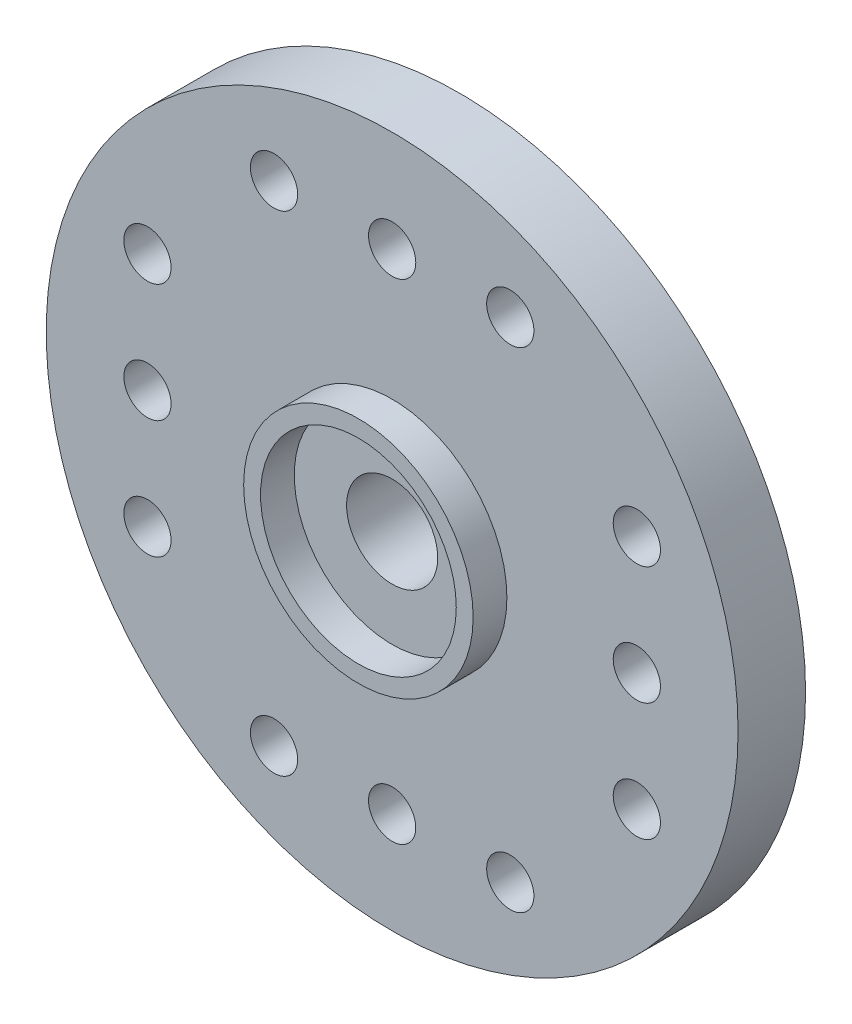
ISO-10303-21;
HEADER;
FILE_DESCRIPTION(('STEP AP214'),'2;1');
FILE_NAME('part.step','',(''),(''),'','','');
FILE_SCHEMA(('AUTOMOTIVE_DESIGN { 1 0 10303 214 1 1 1 1 }'));
ENDSEC;
DATA;
#1=APPLICATION_CONTEXT('core data for automotive mechanical design processes');
#2=APPLICATION_PROTOCOL_DEFINITION('international standard','automotive_design',2000,#1);
#3=PRODUCT_CONTEXT('',#1,'mechanical');
#4=PRODUCT('Part','Part','',(#3));
#5=PRODUCT_RELATED_PRODUCT_CATEGORY('part','',(#4));
#6=PRODUCT_DEFINITION_FORMATION('','',#4);
#7=PRODUCT_DEFINITION_CONTEXT('part definition',#1,'design');
#8=PRODUCT_DEFINITION('design','',#6,#7);
#9=PRODUCT_DEFINITION_SHAPE('','',#8);
#10=(LENGTH_UNIT() NAMED_UNIT(*) SI_UNIT(.MILLI.,.METRE.));
#11=(NAMED_UNIT(*) PLANE_ANGLE_UNIT() SI_UNIT($,.RADIAN.));
#12=(NAMED_UNIT(*) SI_UNIT($,.STERADIAN.) SOLID_ANGLE_UNIT());
#13=UNCERTAINTY_MEASURE_WITH_UNIT(LENGTH_MEASURE(1.E-05),#10,'distance_accuracy_value','');
#14=(GEOMETRIC_REPRESENTATION_CONTEXT(3) GLOBAL_UNCERTAINTY_ASSIGNED_CONTEXT((#13)) GLOBAL_UNIT_ASSIGNED_CONTEXT((#10,
#11,#12)) REPRESENTATION_CONTEXT('',''));
#15=CARTESIAN_POINT('',(0.,0.,0.));
#16=DIRECTION('',(0.,0.,1.));
#17=DIRECTION('',(1.,0.,0.));
#18=AXIS2_PLACEMENT_3D('',#15,#16,#17);
#19=CARTESIAN_POINT('',(0.,0.,0.));
#20=DIRECTION('',(0.,0.,1.));
#21=DIRECTION('',(1.,0.,0.));
#22=AXIS2_PLACEMENT_3D('',#19,#20,#21);
#23=PLANE('',#22);
#24=CARTESIAN_POINT('',(-7.25,0.,0.));
#25=DIRECTION('',(0.,0.,1.));
#26=DIRECTION('',(0.,1.,0.));
#27=AXIS2_PLACEMENT_3D('',#24,#25,#26);
#28=CIRCLE('',#27,0.7);
#29=CARTESIAN_POINT('',(-7.25,0.700000000000025,0.));
#30=VERTEX_POINT('',#29);
#31=EDGE_CURVE('E129',#30,#30,#28,.T.);
#32=ORIENTED_EDGE('',*,*,#31,.T.);
#33=EDGE_LOOP('',(#32));
#34=FACE_BOUND('',#33,.T.);
#35=CARTESIAN_POINT('',(-7.25000000000001,-3.49999999999998,0.));
#36=DIRECTION('',(0.,0.,1.));
#37=DIRECTION('',(0.,1.,0.));
#38=AXIS2_PLACEMENT_3D('',#35,#36,#37);
#39=CIRCLE('',#38,0.700000000000001);
#40=CARTESIAN_POINT('',(-7.25000000000001,-2.79999999999998,0.));
#41=VERTEX_POINT('',#40);
#42=EDGE_CURVE('E123',#41,#41,#39,.T.);
#43=ORIENTED_EDGE('',*,*,#42,.T.);
#44=EDGE_LOOP('',(#43));
#45=FACE_BOUND('',#44,.T.);
#46=CARTESIAN_POINT('',(-7.24999999999999,3.50000000000003,0.));
#47=DIRECTION('',(0.,0.,1.));
#48=DIRECTION('',(0.,-1.,0.));
#49=AXIS2_PLACEMENT_3D('',#46,#47,#48);
#50=CIRCLE('',#49,0.7);
#51=CARTESIAN_POINT('',(-7.24999999999999,2.80000000000003,0.));
#52=VERTEX_POINT('',#51);
#53=EDGE_CURVE('E117',#52,#52,#50,.T.);
#54=ORIENTED_EDGE('',*,*,#53,.T.);
#55=EDGE_LOOP('',(#54));
#56=FACE_BOUND('',#55,.T.);
#57=CARTESIAN_POINT('',(7.25000000000001,3.49999999999998,0.));
#58=DIRECTION('',(0.,0.,1.));
#59=DIRECTION('',(0.,1.,0.));
#60=AXIS2_PLACEMENT_3D('',#57,#58,#59);
#61=CIRCLE('',#60,0.7);
#62=CARTESIAN_POINT('',(7.25000000000001,4.19999999999997,0.));
#63=VERTEX_POINT('',#62);
#64=EDGE_CURVE('E111',#63,#63,#61,.T.);
#65=ORIENTED_EDGE('',*,*,#64,.T.);
#66=EDGE_LOOP('',(#65));
#67=FACE_BOUND('',#66,.T.);
#68=CARTESIAN_POINT('',(7.24999999999999,-3.50000000000003,0.));
#69=DIRECTION('',(0.,0.,1.));
#70=DIRECTION('',(0.,-1.,0.));
#71=AXIS2_PLACEMENT_3D('',#68,#69,#70);
#72=CIRCLE('',#71,0.700000000000001);
#73=CARTESIAN_POINT('',(7.24999999999999,-4.20000000000003,0.));
#74=VERTEX_POINT('',#73);
#75=EDGE_CURVE('E105',#74,#74,#72,.T.);
#76=ORIENTED_EDGE('',*,*,#75,.T.);
#77=EDGE_LOOP('',(#76));
#78=FACE_BOUND('',#77,.T.);
#79=CARTESIAN_POINT('',(7.25,0.,0.));
#80=DIRECTION('',(0.,0.,1.));
#81=DIRECTION('',(0.,-1.,0.));
#82=AXIS2_PLACEMENT_3D('',#79,#80,#81);
#83=CIRCLE('',#82,0.7);
#84=CARTESIAN_POINT('',(7.25,-0.700000000000025,0.));
#85=VERTEX_POINT('',#84);
#86=EDGE_CURVE('E99',#85,#85,#83,.T.);
#87=ORIENTED_EDGE('',*,*,#86,.T.);
#88=EDGE_LOOP('',(#87));
#89=FACE_BOUND('',#88,.T.);
#90=CARTESIAN_POINT('',(0.,-7.25,0.));
#91=DIRECTION('',(0.,0.,1.));
#92=DIRECTION('',(-1.,0.,0.));
#93=AXIS2_PLACEMENT_3D('',#90,#91,#92);
#94=CIRCLE('',#93,0.7);
#95=CARTESIAN_POINT('',(-0.7,-7.25,0.));
#96=VERTEX_POINT('',#95);
#97=EDGE_CURVE('E93',#96,#96,#94,.T.);
#98=ORIENTED_EDGE('',*,*,#97,.T.);
#99=EDGE_LOOP('',(#98));
#100=FACE_BOUND('',#99,.T.);
#101=CARTESIAN_POINT('',(3.5,-7.25,0.));
#102=DIRECTION('',(0.,0.,1.));
#103=DIRECTION('',(-1.,0.,0.));
#104=AXIS2_PLACEMENT_3D('',#101,#102,#103);
#105=CIRCLE('',#104,0.700000000000001);
#106=CARTESIAN_POINT('',(2.8,-7.25,0.));
#107=VERTEX_POINT('',#106);
#108=EDGE_CURVE('E87',#107,#107,#105,.T.);
#109=ORIENTED_EDGE('',*,*,#108,.T.);
#110=EDGE_LOOP('',(#109));
#111=FACE_BOUND('',#110,.T.);
#112=CARTESIAN_POINT('',(-3.5,-7.25,0.));
#113=DIRECTION('',(0.,0.,1.));
#114=DIRECTION('',(1.,0.,0.));
#115=AXIS2_PLACEMENT_3D('',#112,#113,#114);
#116=CIRCLE('',#115,0.7);
#117=CARTESIAN_POINT('',(-2.8,-7.25,0.));
#118=VERTEX_POINT('',#117);
#119=EDGE_CURVE('E81',#118,#118,#116,.T.);
#120=ORIENTED_EDGE('',*,*,#119,.T.);
#121=EDGE_LOOP('',(#120));
#122=FACE_BOUND('',#121,.T.);
#123=CARTESIAN_POINT('',(-3.5,7.25,0.));
#124=DIRECTION('',(0.,0.,1.));
#125=DIRECTION('',(-1.,0.,0.));
#126=AXIS2_PLACEMENT_3D('',#123,#124,#125);
#127=CIRCLE('',#126,0.7);
#128=CARTESIAN_POINT('',(-4.2,7.25,0.));
#129=VERTEX_POINT('',#128);
#130=EDGE_CURVE('E75',#129,#129,#127,.T.);
#131=ORIENTED_EDGE('',*,*,#130,.T.);
#132=EDGE_LOOP('',(#131));
#133=FACE_BOUND('',#132,.T.);
#134=CARTESIAN_POINT('',(3.5,7.25,0.));
#135=DIRECTION('',(0.,0.,1.));
#136=DIRECTION('',(1.,0.,0.));
#137=AXIS2_PLACEMENT_3D('',#134,#135,#136);
#138=CIRCLE('',#137,0.700000000000001);
#139=CARTESIAN_POINT('',(4.2,7.25,0.));
#140=VERTEX_POINT('',#139);
#141=EDGE_CURVE('E69',#140,#140,#138,.T.);
#142=ORIENTED_EDGE('',*,*,#141,.T.);
#143=EDGE_LOOP('',(#142));
#144=FACE_BOUND('',#143,.T.);
#145=CARTESIAN_POINT('',(0.,7.25,0.));
#146=DIRECTION('',(0.,0.,1.));
#147=DIRECTION('',(1.,0.,0.));
#148=AXIS2_PLACEMENT_3D('',#145,#146,#147);
#149=CIRCLE('',#148,0.7);
#150=CARTESIAN_POINT('',(0.7,7.25,0.));
#151=VERTEX_POINT('',#150);
#152=EDGE_CURVE('E63',#151,#151,#149,.T.);
#153=ORIENTED_EDGE('',*,*,#152,.T.);
#154=EDGE_LOOP('',(#153));
#155=FACE_BOUND('',#154,.T.);
#156=CARTESIAN_POINT('',(0.,0.,0.));
#157=DIRECTION('',(0.,0.,1.));
#158=DIRECTION('',(1.,0.,0.));
#159=AXIS2_PLACEMENT_3D('',#156,#157,#158);
#160=CIRCLE('',#159,10.25);
#161=CARTESIAN_POINT('',(10.25,0.,0.));
#162=VERTEX_POINT('',#161);
#163=EDGE_CURVE('E45',#162,#162,#160,.T.);
#164=ORIENTED_EDGE('',*,*,#163,.F.);
#165=EDGE_LOOP('',(#164));
#166=FACE_BOUND('',#165,.T.);
#167=CARTESIAN_POINT('',(0.,0.,0.));
#168=DIRECTION('',(0.,0.,1.));
#169=DIRECTION('',(1.,0.,0.));
#170=AXIS2_PLACEMENT_3D('',#167,#168,#169);
#171=CIRCLE('',#170,4.85);
#172=CARTESIAN_POINT('',(4.85,0.,0.));
#173=VERTEX_POINT('',#172);
#174=EDGE_CURVE('E10',#173,#173,#171,.F.);
#175=ORIENTED_EDGE('',*,*,#174,.F.);
#176=EDGE_LOOP('',(#175));
#177=FACE_BOUND('',#176,.T.);
#178=ADVANCED_FACE('F30',(#34,#45,#56,#67,#78,#89,#100,#111,#122,#133,#144,#155,#166,#177),#23,.F.);
#179=CARTESIAN_POINT('',(0.,0.,2.));
#180=DIRECTION('',(0.,0.,1.));
#181=DIRECTION('',(1.,0.,0.));
#182=AXIS2_PLACEMENT_3D('',#179,#180,#181);
#183=PLANE('',#182);
#184=CARTESIAN_POINT('',(-7.25,0.,2.));
#185=DIRECTION('',(0.,0.,1.));
#186=DIRECTION('',(0.,1.,0.));
#187=AXIS2_PLACEMENT_3D('',#184,#185,#186);
#188=CIRCLE('',#187,0.7);
#189=CARTESIAN_POINT('',(-7.25,0.700000000000025,2.));
#190=VERTEX_POINT('',#189);
#191=EDGE_CURVE('E132',#190,#190,#188,.T.);
#192=ORIENTED_EDGE('',*,*,#191,.F.);
#193=EDGE_LOOP('',(#192));
#194=FACE_BOUND('',#193,.T.);
#195=CARTESIAN_POINT('',(-7.25000000000001,-3.49999999999998,2.));
#196=DIRECTION('',(0.,0.,1.));
#197=DIRECTION('',(0.,1.,0.));
#198=AXIS2_PLACEMENT_3D('',#195,#196,#197);
#199=CIRCLE('',#198,0.700000000000001);
#200=CARTESIAN_POINT('',(-7.25000000000001,-2.79999999999998,2.));
#201=VERTEX_POINT('',#200);
#202=EDGE_CURVE('E126',#201,#201,#199,.T.);
#203=ORIENTED_EDGE('',*,*,#202,.F.);
#204=EDGE_LOOP('',(#203));
#205=FACE_BOUND('',#204,.T.);
#206=CARTESIAN_POINT('',(-7.24999999999999,3.50000000000003,2.));
#207=DIRECTION('',(0.,0.,1.));
#208=DIRECTION('',(0.,-1.,0.));
#209=AXIS2_PLACEMENT_3D('',#206,#207,#208);
#210=CIRCLE('',#209,0.7);
#211=CARTESIAN_POINT('',(-7.24999999999999,2.80000000000003,2.));
#212=VERTEX_POINT('',#211);
#213=EDGE_CURVE('E120',#212,#212,#210,.T.);
#214=ORIENTED_EDGE('',*,*,#213,.F.);
#215=EDGE_LOOP('',(#214));
#216=FACE_BOUND('',#215,.T.);
#217=CARTESIAN_POINT('',(7.25000000000001,3.49999999999998,2.));
#218=DIRECTION('',(0.,0.,1.));
#219=DIRECTION('',(0.,1.,0.));
#220=AXIS2_PLACEMENT_3D('',#217,#218,#219);
#221=CIRCLE('',#220,0.7);
#222=CARTESIAN_POINT('',(7.25000000000001,4.19999999999997,2.));
#223=VERTEX_POINT('',#222);
#224=EDGE_CURVE('E114',#223,#223,#221,.T.);
#225=ORIENTED_EDGE('',*,*,#224,.F.);
#226=EDGE_LOOP('',(#225));
#227=FACE_BOUND('',#226,.T.);
#228=CARTESIAN_POINT('',(7.24999999999999,-3.50000000000003,2.));
#229=DIRECTION('',(0.,0.,1.));
#230=DIRECTION('',(0.,-1.,0.));
#231=AXIS2_PLACEMENT_3D('',#228,#229,#230);
#232=CIRCLE('',#231,0.700000000000001);
#233=CARTESIAN_POINT('',(7.24999999999999,-4.20000000000003,2.));
#234=VERTEX_POINT('',#233);
#235=EDGE_CURVE('E108',#234,#234,#232,.T.);
#236=ORIENTED_EDGE('',*,*,#235,.F.);
#237=EDGE_LOOP('',(#236));
#238=FACE_BOUND('',#237,.T.);
#239=CARTESIAN_POINT('',(7.25,0.,2.));
#240=DIRECTION('',(0.,0.,1.));
#241=DIRECTION('',(0.,-1.,0.));
#242=AXIS2_PLACEMENT_3D('',#239,#240,#241);
#243=CIRCLE('',#242,0.7);
#244=CARTESIAN_POINT('',(7.25,-0.700000000000025,2.));
#245=VERTEX_POINT('',#244);
#246=EDGE_CURVE('E102',#245,#245,#243,.T.);
#247=ORIENTED_EDGE('',*,*,#246,.F.);
#248=EDGE_LOOP('',(#247));
#249=FACE_BOUND('',#248,.T.);
#250=CARTESIAN_POINT('',(0.,-7.25,2.));
#251=DIRECTION('',(0.,0.,1.));
#252=DIRECTION('',(-1.,0.,0.));
#253=AXIS2_PLACEMENT_3D('',#250,#251,#252);
#254=CIRCLE('',#253,0.7);
#255=CARTESIAN_POINT('',(-0.7,-7.25,2.));
#256=VERTEX_POINT('',#255);
#257=EDGE_CURVE('E96',#256,#256,#254,.T.);
#258=ORIENTED_EDGE('',*,*,#257,.F.);
#259=EDGE_LOOP('',(#258));
#260=FACE_BOUND('',#259,.T.);
#261=CARTESIAN_POINT('',(3.5,-7.25,2.));
#262=DIRECTION('',(0.,0.,1.));
#263=DIRECTION('',(-1.,0.,0.));
#264=AXIS2_PLACEMENT_3D('',#261,#262,#263);
#265=CIRCLE('',#264,0.700000000000001);
#266=CARTESIAN_POINT('',(2.8,-7.25,2.));
#267=VERTEX_POINT('',#266);
#268=EDGE_CURVE('E90',#267,#267,#265,.T.);
#269=ORIENTED_EDGE('',*,*,#268,.F.);
#270=EDGE_LOOP('',(#269));
#271=FACE_BOUND('',#270,.T.);
#272=CARTESIAN_POINT('',(-3.5,-7.25,2.));
#273=DIRECTION('',(0.,0.,1.));
#274=DIRECTION('',(1.,0.,0.));
#275=AXIS2_PLACEMENT_3D('',#272,#273,#274);
#276=CIRCLE('',#275,0.7);
#277=CARTESIAN_POINT('',(-2.8,-7.25,2.));
#278=VERTEX_POINT('',#277);
#279=EDGE_CURVE('E84',#278,#278,#276,.T.);
#280=ORIENTED_EDGE('',*,*,#279,.F.);
#281=EDGE_LOOP('',(#280));
#282=FACE_BOUND('',#281,.T.);
#283=CARTESIAN_POINT('',(-3.5,7.25,2.));
#284=DIRECTION('',(0.,0.,1.));
#285=DIRECTION('',(-1.,0.,0.));
#286=AXIS2_PLACEMENT_3D('',#283,#284,#285);
#287=CIRCLE('',#286,0.7);
#288=CARTESIAN_POINT('',(-4.2,7.25,2.));
#289=VERTEX_POINT('',#288);
#290=EDGE_CURVE('E78',#289,#289,#287,.T.);
#291=ORIENTED_EDGE('',*,*,#290,.F.);
#292=EDGE_LOOP('',(#291));
#293=FACE_BOUND('',#292,.T.);
#294=CARTESIAN_POINT('',(3.5,7.25,2.));
#295=DIRECTION('',(0.,0.,1.));
#296=DIRECTION('',(1.,0.,0.));
#297=AXIS2_PLACEMENT_3D('',#294,#295,#296);
#298=CIRCLE('',#297,0.700000000000001);
#299=CARTESIAN_POINT('',(4.2,7.25,2.));
#300=VERTEX_POINT('',#299);
#301=EDGE_CURVE('E72',#300,#300,#298,.T.);
#302=ORIENTED_EDGE('',*,*,#301,.F.);
#303=EDGE_LOOP('',(#302));
#304=FACE_BOUND('',#303,.T.);
#305=CARTESIAN_POINT('',(0.,7.25,2.));
#306=DIRECTION('',(0.,0.,1.));
#307=DIRECTION('',(1.,0.,0.));
#308=AXIS2_PLACEMENT_3D('',#305,#306,#307);
#309=CIRCLE('',#308,0.7);
#310=CARTESIAN_POINT('',(0.7,7.25,2.));
#311=VERTEX_POINT('',#310);
#312=EDGE_CURVE('E66',#311,#311,#309,.T.);
#313=ORIENTED_EDGE('',*,*,#312,.F.);
#314=EDGE_LOOP('',(#313));
#315=FACE_BOUND('',#314,.T.);
#316=CARTESIAN_POINT('',(0.,0.,2.));
#317=DIRECTION('',(0.,0.,1.));
#318=DIRECTION('',(1.,0.,0.));
#319=AXIS2_PLACEMENT_3D('',#316,#317,#318);
#320=CIRCLE('',#319,10.25);
#321=CARTESIAN_POINT('',(10.25,0.,2.));
#322=VERTEX_POINT('',#321);
#323=EDGE_CURVE('E41',#322,#322,#320,.T.);
#324=ORIENTED_EDGE('',*,*,#323,.T.);
#325=EDGE_LOOP('',(#324));
#326=FACE_BOUND('',#325,.T.);
#327=CARTESIAN_POINT('',(0.,0.,2.));
#328=DIRECTION('',(0.,0.,1.));
#329=DIRECTION('',(1.,0.,0.));
#330=AXIS2_PLACEMENT_3D('',#327,#328,#329);
#331=CIRCLE('',#330,3.4);
#332=CARTESIAN_POINT('',(3.4,0.,2.));
#333=VERTEX_POINT('',#332);
#334=EDGE_CURVE('E51',#333,#333,#331,.T.);
#335=ORIENTED_EDGE('',*,*,#334,.F.);
#336=EDGE_LOOP('',(#335));
#337=FACE_BOUND('',#336,.T.);
#338=ADVANCED_FACE('F167',(#194,#205,#216,#227,#238,#249,#260,#271,#282,#293,#304,#315,#326,
#337),#183,.T.);
#339=CARTESIAN_POINT('',(0.,0.,2.));
#340=DIRECTION('',(0.,0.,-1.));
#341=DIRECTION('',(-1.,0.,0.));
#342=AXIS2_PLACEMENT_3D('',#339,#340,#341);
#343=CYLINDRICAL_SURFACE('',#342,10.25);
#344=ORIENTED_EDGE('',*,*,#323,.F.);
#345=EDGE_LOOP('',(#344));
#346=FACE_BOUND('',#345,.T.);
#347=ORIENTED_EDGE('',*,*,#163,.T.);
#348=EDGE_LOOP('',(#347));
#349=FACE_BOUND('',#348,.T.);
#350=ADVANCED_FACE('F32',(#346,#349),#343,.T.);
#351=CARTESIAN_POINT('',(0.,0.,0.));
#352=DIRECTION('',(0.,0.,-1.));
#353=DIRECTION('',(-1.,0.,0.));
#354=AXIS2_PLACEMENT_3D('',#351,#352,#353);
#355=CIRCLE('',#354,2.7);
#356=CARTESIAN_POINT('',(-2.7,0.,0.));
#357=VERTEX_POINT('',#356);
#358=EDGE_CURVE('E141',#357,#357,#355,.T.);
#359=ORIENTED_EDGE('',*,*,#358,.T.);
#360=EDGE_LOOP('',(#359));
#361=FACE_BOUND('',#360,.T.);
#362=CARTESIAN_POINT('',(0.,0.,0.));
#363=DIRECTION('',(0.,0.,1.));
#364=DIRECTION('',(1.,0.,0.));
#365=AXIS2_PLACEMENT_3D('',#362,#363,#364);
#366=CIRCLE('',#365,1.35);
#367=CARTESIAN_POINT('',(1.35,0.,0.));
#368=VERTEX_POINT('',#367);
#369=EDGE_CURVE('E59',#368,#368,#366,.T.);
#370=ORIENTED_EDGE('',*,*,#369,.T.);
#371=EDGE_LOOP('',(#370));
#372=FACE_BOUND('',#371,.T.);
#373=ADVANCED_FACE('F169',(#361,#372),#23,.F.);
#374=CARTESIAN_POINT('',(0.,0.,3.));
#375=DIRECTION('',(0.,0.,1.));
#376=DIRECTION('',(1.,0.,0.));
#377=AXIS2_PLACEMENT_3D('',#374,#375,#376);
#378=PLANE('',#377);
#379=CARTESIAN_POINT('',(0.,0.,3.));
#380=DIRECTION('',(0.,0.,1.));
#381=DIRECTION('',(1.,0.,0.));
#382=AXIS2_PLACEMENT_3D('',#379,#380,#381);
#383=CIRCLE('',#382,3.4);
#384=CARTESIAN_POINT('',(3.4,0.,3.));
#385=VERTEX_POINT('',#384);
#386=EDGE_CURVE('E49',#385,#385,#383,.T.);
#387=ORIENTED_EDGE('',*,*,#386,.T.);
#388=EDGE_LOOP('',(#387));
#389=FACE_BOUND('',#388,.T.);
#390=CARTESIAN_POINT('',(0.,0.,3.));
#391=DIRECTION('',(0.,0.,1.));
#392=DIRECTION('',(1.,0.,0.));
#393=AXIS2_PLACEMENT_3D('',#390,#391,#392);
#394=CIRCLE('',#393,2.9);
#395=CARTESIAN_POINT('',(2.9,0.,3.));
#396=VERTEX_POINT('',#395);
#397=EDGE_CURVE('E54',#396,#396,#394,.T.);
#398=ORIENTED_EDGE('',*,*,#397,.F.);
#399=EDGE_LOOP('',(#398));
#400=FACE_BOUND('',#399,.T.);
#401=ADVANCED_FACE('F178',(#389,#400),#378,.T.);
#402=CARTESIAN_POINT('',(0.,0.,3.));
#403=DIRECTION('',(0.,0.,-1.));
#404=DIRECTION('',(-1.,0.,0.));
#405=AXIS2_PLACEMENT_3D('',#402,#403,#404);
#406=CYLINDRICAL_SURFACE('',#405,3.4);
#407=ORIENTED_EDGE('',*,*,#386,.F.);
#408=EDGE_LOOP('',(#407));
#409=FACE_BOUND('',#408,.T.);
#410=ORIENTED_EDGE('',*,*,#334,.T.);
#411=EDGE_LOOP('',(#410));
#412=FACE_BOUND('',#411,.T.);
#413=ADVANCED_FACE('F184',(#409,#412),#406,.T.);
#414=CARTESIAN_POINT('',(0.,0.,3.));
#415=DIRECTION('',(0.,0.,-1.));
#416=DIRECTION('',(-1.,0.,0.));
#417=AXIS2_PLACEMENT_3D('',#414,#415,#416);
#418=CYLINDRICAL_SURFACE('',#417,2.9);
#419=ORIENTED_EDGE('',*,*,#397,.T.);
#420=EDGE_LOOP('',(#419));
#421=FACE_BOUND('',#420,.T.);
#422=CARTESIAN_POINT('',(0.,0.,2.));
#423=DIRECTION('',(0.,0.,1.));
#424=DIRECTION('',(1.,0.,0.));
#425=AXIS2_PLACEMENT_3D('',#422,#423,#424);
#426=CIRCLE('',#425,2.9);
#427=CARTESIAN_POINT('',(2.9,0.,2.));
#428=VERTEX_POINT('',#427);
#429=EDGE_CURVE('E37',#428,#428,#426,.F.);
#430=ORIENTED_EDGE('',*,*,#429,.T.);
#431=EDGE_LOOP('',(#430));
#432=FACE_BOUND('',#431,.T.);
#433=ADVANCED_FACE('F201',(#421,#432),#418,.F.);
#434=CARTESIAN_POINT('',(0.,0.,2.));
#435=DIRECTION('',(0.,0.,1.));
#436=DIRECTION('',(1.,0.,0.));
#437=AXIS2_PLACEMENT_3D('',#434,#435,#436);
#438=CIRCLE('',#437,1.35);
#439=CARTESIAN_POINT('',(1.35,0.,2.));
#440=VERTEX_POINT('',#439);
#441=EDGE_CURVE('E60',#440,#440,#438,.T.);
#442=ORIENTED_EDGE('',*,*,#441,.F.);
#443=EDGE_LOOP('',(#442));
#444=FACE_BOUND('',#443,.T.);
#445=ORIENTED_EDGE('',*,*,#429,.F.);
#446=EDGE_LOOP('',(#445));
#447=FACE_BOUND('',#446,.T.);
#448=ADVANCED_FACE('F175',(#444,#447),#183,.T.);
#449=CARTESIAN_POINT('',(0.,0.,0.));
#450=DIRECTION('',(0.,0.,1.));
#451=DIRECTION('',(1.,0.,0.));
#452=AXIS2_PLACEMENT_3D('',#449,#450,#451);
#453=CYLINDRICAL_SURFACE('',#452,1.35);
#454=ORIENTED_EDGE('',*,*,#369,.F.);
#455=EDGE_LOOP('',(#454));
#456=FACE_BOUND('',#455,.T.);
#457=ORIENTED_EDGE('',*,*,#441,.T.);
#458=EDGE_LOOP('',(#457));
#459=FACE_BOUND('',#458,.T.);
#460=ADVANCED_FACE('F192',(#456,#459),#453,.F.);
#461=CARTESIAN_POINT('',(0.,7.25,0.));
#462=DIRECTION('',(0.,0.,1.));
#463=DIRECTION('',(1.,0.,0.));
#464=AXIS2_PLACEMENT_3D('',#461,#462,#463);
#465=CYLINDRICAL_SURFACE('',#464,0.7);
#466=ORIENTED_EDGE('',*,*,#152,.F.);
#467=EDGE_LOOP('',(#466));
#468=FACE_BOUND('',#467,.T.);
#469=ORIENTED_EDGE('',*,*,#312,.T.);
#470=EDGE_LOOP('',(#469));
#471=FACE_BOUND('',#470,.T.);
#472=ADVANCED_FACE('F195',(#468,#471),#465,.F.);
#473=CARTESIAN_POINT('',(3.5,7.25,0.));
#474=DIRECTION('',(0.,0.,1.));
#475=DIRECTION('',(1.,0.,0.));
#476=AXIS2_PLACEMENT_3D('',#473,#474,#475);
#477=CYLINDRICAL_SURFACE('',#476,0.700000000000001);
#478=ORIENTED_EDGE('',*,*,#141,.F.);
#479=EDGE_LOOP('',(#478));
#480=FACE_BOUND('',#479,.T.);
#481=ORIENTED_EDGE('',*,*,#301,.T.);
#482=EDGE_LOOP('',(#481));
#483=FACE_BOUND('',#482,.T.);
#484=ADVANCED_FACE('F213',(#480,#483),#477,.F.);
#485=CARTESIAN_POINT('',(-3.5,7.25,0.));
#486=DIRECTION('',(0.,0.,1.));
#487=DIRECTION('',(1.,0.,0.));
#488=AXIS2_PLACEMENT_3D('',#485,#486,#487);
#489=CYLINDRICAL_SURFACE('',#488,0.7);
#490=ORIENTED_EDGE('',*,*,#130,.F.);
#491=EDGE_LOOP('',(#490));
#492=FACE_BOUND('',#491,.T.);
#493=ORIENTED_EDGE('',*,*,#290,.T.);
#494=EDGE_LOOP('',(#493));
#495=FACE_BOUND('',#494,.T.);
#496=ADVANCED_FACE('F217',(#492,#495),#489,.F.);
#497=CARTESIAN_POINT('',(-3.5,-7.25,0.));
#498=DIRECTION('',(0.,0.,1.));
#499=DIRECTION('',(1.,0.,0.));
#500=AXIS2_PLACEMENT_3D('',#497,#498,#499);
#501=CYLINDRICAL_SURFACE('',#500,0.7);
#502=ORIENTED_EDGE('',*,*,#119,.F.);
#503=EDGE_LOOP('',(#502));
#504=FACE_BOUND('',#503,.T.);
#505=ORIENTED_EDGE('',*,*,#279,.T.);
#506=EDGE_LOOP('',(#505));
#507=FACE_BOUND('',#506,.T.);
#508=ADVANCED_FACE('F221',(#504,#507),#501,.F.);
#509=CARTESIAN_POINT('',(3.5,-7.25,0.));
#510=DIRECTION('',(0.,0.,1.));
#511=DIRECTION('',(1.,0.,0.));
#512=AXIS2_PLACEMENT_3D('',#509,#510,#511);
#513=CYLINDRICAL_SURFACE('',#512,0.700000000000001);
#514=ORIENTED_EDGE('',*,*,#108,.F.);
#515=EDGE_LOOP('',(#514));
#516=FACE_BOUND('',#515,.T.);
#517=ORIENTED_EDGE('',*,*,#268,.T.);
#518=EDGE_LOOP('',(#517));
#519=FACE_BOUND('',#518,.T.);
#520=ADVANCED_FACE('F225',(#516,#519),#513,.F.);
#521=CARTESIAN_POINT('',(0.,-7.25,0.));
#522=DIRECTION('',(0.,0.,1.));
#523=DIRECTION('',(1.,0.,0.));
#524=AXIS2_PLACEMENT_3D('',#521,#522,#523);
#525=CYLINDRICAL_SURFACE('',#524,0.7);
#526=ORIENTED_EDGE('',*,*,#97,.F.);
#527=EDGE_LOOP('',(#526));
#528=FACE_BOUND('',#527,.T.);
#529=ORIENTED_EDGE('',*,*,#257,.T.);
#530=EDGE_LOOP('',(#529));
#531=FACE_BOUND('',#530,.T.);
#532=ADVANCED_FACE('F229',(#528,#531),#525,.F.);
#533=CARTESIAN_POINT('',(7.25,0.,0.));
#534=DIRECTION('',(0.,0.,1.));
#535=DIRECTION('',(1.,0.,0.));
#536=AXIS2_PLACEMENT_3D('',#533,#534,#535);
#537=CYLINDRICAL_SURFACE('',#536,0.7);
#538=ORIENTED_EDGE('',*,*,#86,.F.);
#539=EDGE_LOOP('',(#538));
#540=FACE_BOUND('',#539,.T.);
#541=ORIENTED_EDGE('',*,*,#246,.T.);
#542=EDGE_LOOP('',(#541));
#543=FACE_BOUND('',#542,.T.);
#544=ADVANCED_FACE('F233',(#540,#543),#537,.F.);
#545=CARTESIAN_POINT('',(7.24999999999999,-3.50000000000003,0.));
#546=DIRECTION('',(0.,0.,1.));
#547=DIRECTION('',(1.,0.,0.));
#548=AXIS2_PLACEMENT_3D('',#545,#546,#547);
#549=CYLINDRICAL_SURFACE('',#548,0.700000000000001);
#550=ORIENTED_EDGE('',*,*,#75,.F.);
#551=EDGE_LOOP('',(#550));
#552=FACE_BOUND('',#551,.T.);
#553=ORIENTED_EDGE('',*,*,#235,.T.);
#554=EDGE_LOOP('',(#553));
#555=FACE_BOUND('',#554,.T.);
#556=ADVANCED_FACE('F237',(#552,#555),#549,.F.);
#557=CARTESIAN_POINT('',(7.25000000000001,3.49999999999998,0.));
#558=DIRECTION('',(0.,0.,1.));
#559=DIRECTION('',(1.,0.,0.));
#560=AXIS2_PLACEMENT_3D('',#557,#558,#559);
#561=CYLINDRICAL_SURFACE('',#560,0.7);
#562=ORIENTED_EDGE('',*,*,#64,.F.);
#563=EDGE_LOOP('',(#562));
#564=FACE_BOUND('',#563,.T.);
#565=ORIENTED_EDGE('',*,*,#224,.T.);
#566=EDGE_LOOP('',(#565));
#567=FACE_BOUND('',#566,.T.);
#568=ADVANCED_FACE('F241',(#564,#567),#561,.F.);
#569=CARTESIAN_POINT('',(-7.24999999999999,3.50000000000003,0.));
#570=DIRECTION('',(0.,0.,1.));
#571=DIRECTION('',(1.,0.,0.));
#572=AXIS2_PLACEMENT_3D('',#569,#570,#571);
#573=CYLINDRICAL_SURFACE('',#572,0.7);
#574=ORIENTED_EDGE('',*,*,#53,.F.);
#575=EDGE_LOOP('',(#574));
#576=FACE_BOUND('',#575,.T.);
#577=ORIENTED_EDGE('',*,*,#213,.T.);
#578=EDGE_LOOP('',(#577));
#579=FACE_BOUND('',#578,.T.);
#580=ADVANCED_FACE('F245',(#576,#579),#573,.F.);
#581=CARTESIAN_POINT('',(-7.25000000000001,-3.49999999999998,0.));
#582=DIRECTION('',(0.,0.,1.));
#583=DIRECTION('',(1.,0.,0.));
#584=AXIS2_PLACEMENT_3D('',#581,#582,#583);
#585=CYLINDRICAL_SURFACE('',#584,0.700000000000001);
#586=ORIENTED_EDGE('',*,*,#42,.F.);
#587=EDGE_LOOP('',(#586));
#588=FACE_BOUND('',#587,.T.);
#589=ORIENTED_EDGE('',*,*,#202,.T.);
#590=EDGE_LOOP('',(#589));
#591=FACE_BOUND('',#590,.T.);
#592=ADVANCED_FACE('F162',(#588,#591),#585,.F.);
#593=CARTESIAN_POINT('',(-7.25,0.,0.));
#594=DIRECTION('',(0.,0.,1.));
#595=DIRECTION('',(1.,0.,0.));
#596=AXIS2_PLACEMENT_3D('',#593,#594,#595);
#597=CYLINDRICAL_SURFACE('',#596,0.7);
#598=ORIENTED_EDGE('',*,*,#31,.F.);
#599=EDGE_LOOP('',(#598));
#600=FACE_BOUND('',#599,.T.);
#601=ORIENTED_EDGE('',*,*,#191,.T.);
#602=EDGE_LOOP('',(#601));
#603=FACE_BOUND('',#602,.T.);
#604=ADVANCED_FACE('F153',(#600,#603),#597,.F.);
#605=CARTESIAN_POINT('',(0.,0.,-3.));
#606=DIRECTION('',(0.,0.,-1.));
#607=DIRECTION('',(-1.,0.,0.));
#608=AXIS2_PLACEMENT_3D('',#605,#606,#607);
#609=PLANE('',#608);
#610=CARTESIAN_POINT('',(0.,0.,-3.));
#611=DIRECTION('',(0.,0.,-1.));
#612=DIRECTION('',(-1.,0.,0.));
#613=AXIS2_PLACEMENT_3D('',#610,#611,#612);
#614=CIRCLE('',#613,4.85);
#615=CARTESIAN_POINT('',(-4.85,0.,-3.));
#616=VERTEX_POINT('',#615);
#617=EDGE_CURVE('E135',#616,#616,#614,.T.);
#618=ORIENTED_EDGE('',*,*,#617,.T.);
#619=EDGE_LOOP('',(#618));
#620=FACE_BOUND('',#619,.T.);
#621=CARTESIAN_POINT('',(0.,0.,-3.));
#622=DIRECTION('',(0.,0.,-1.));
#623=DIRECTION('',(-1.,0.,0.));
#624=AXIS2_PLACEMENT_3D('',#621,#622,#623);
#625=CIRCLE('',#624,2.7);
#626=CARTESIAN_POINT('',(-2.7,0.,-3.));
#627=VERTEX_POINT('',#626);
#628=EDGE_CURVE('E140',#627,#627,#625,.T.);
#629=ORIENTED_EDGE('',*,*,#628,.F.);
#630=EDGE_LOOP('',(#629));
#631=FACE_BOUND('',#630,.T.);
#632=ADVANCED_FACE('F150',(#620,#631),#609,.T.);
#633=CARTESIAN_POINT('',(0.,0.,-3.));
#634=DIRECTION('',(0.,0.,1.));
#635=DIRECTION('',(1.,0.,0.));
#636=AXIS2_PLACEMENT_3D('',#633,#634,#635);
#637=CYLINDRICAL_SURFACE('',#636,4.85);
#638=ORIENTED_EDGE('',*,*,#617,.F.);
#639=EDGE_LOOP('',(#638));
#640=FACE_BOUND('',#639,.T.);
#641=ORIENTED_EDGE('',*,*,#174,.T.);
#642=EDGE_LOOP('',(#641));
#643=FACE_BOUND('',#642,.T.);
#644=ADVANCED_FACE('F152',(#640,#643),#637,.T.);
#645=CARTESIAN_POINT('',(0.,0.,-3.));
#646=DIRECTION('',(0.,0.,1.));
#647=DIRECTION('',(1.,0.,0.));
#648=AXIS2_PLACEMENT_3D('',#645,#646,#647);
#649=CYLINDRICAL_SURFACE('',#648,2.7);
#650=ORIENTED_EDGE('',*,*,#628,.T.);
#651=EDGE_LOOP('',(#650));
#652=FACE_BOUND('',#651,.T.);
#653=ORIENTED_EDGE('',*,*,#358,.F.);
#654=EDGE_LOOP('',(#653));
#655=FACE_BOUND('',#654,.T.);
#656=ADVANCED_FACE('F147',(#652,#655),#649,.F.);
#657=CLOSED_SHELL('',(#178,#338,#350,#373,#401,#413,#433,#448,#460,#472,#484,#496,#508,#520,
#532,#544,#556,#568,#580,#592,#604,#632,#644,#656));
#658=MANIFOLD_SOLID_BREP('B2',#657);
#659=ADVANCED_BREP_SHAPE_REPRESENTATION('',(#18,#658),#14);
#660=SHAPE_DEFINITION_REPRESENTATION(#9,#659);
ENDSEC;
END-ISO-10303-21;
